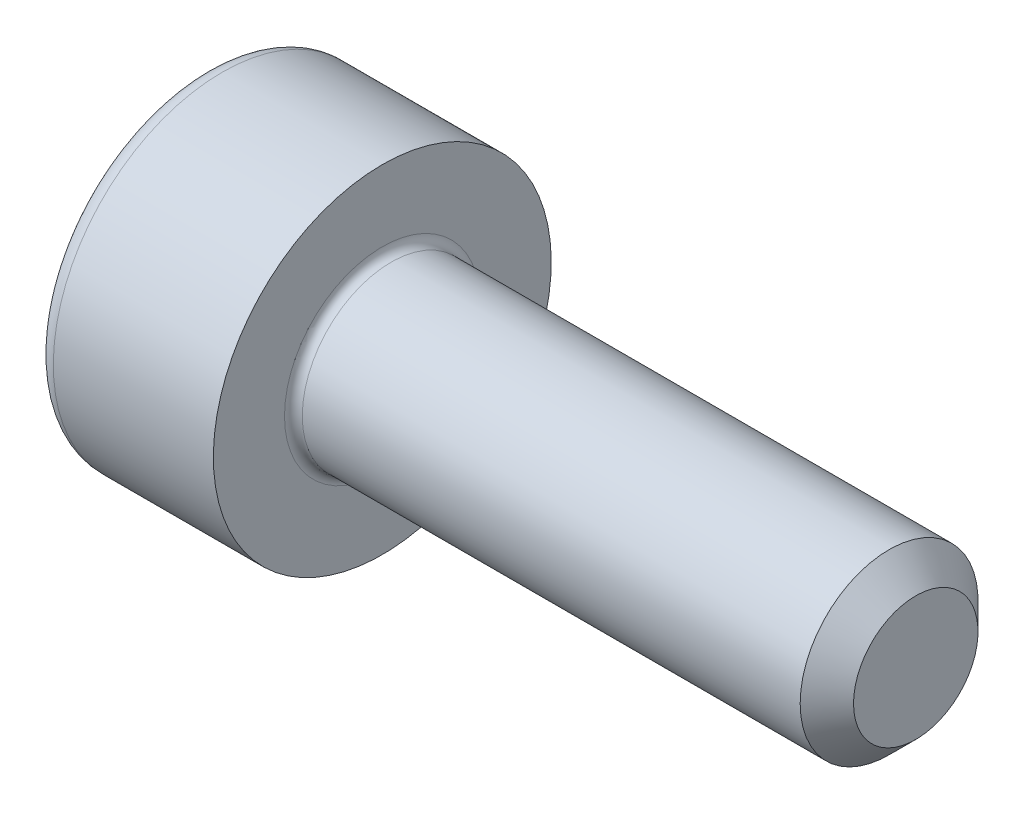
ISO-10303-21;
HEADER;
FILE_DESCRIPTION(('STEP AP214'),'2;1');
FILE_NAME('part.step','',(''),(''),'','','');
FILE_SCHEMA(('AUTOMOTIVE_DESIGN { 1 0 10303 214 1 1 1 1 }'));
ENDSEC;
DATA;
#1=APPLICATION_CONTEXT('core data for automotive mechanical design processes');
#2=APPLICATION_PROTOCOL_DEFINITION('international standard','automotive_design',2000,#1);
#3=PRODUCT_CONTEXT('',#1,'mechanical');
#4=PRODUCT('Part','Part','',(#3));
#5=PRODUCT_RELATED_PRODUCT_CATEGORY('part','',(#4));
#6=PRODUCT_DEFINITION_FORMATION('','',#4);
#7=PRODUCT_DEFINITION_CONTEXT('part definition',#1,'design');
#8=PRODUCT_DEFINITION('design','',#6,#7);
#9=PRODUCT_DEFINITION_SHAPE('','',#8);
#10=(LENGTH_UNIT() NAMED_UNIT(*) SI_UNIT(.MILLI.,.METRE.));
#11=(NAMED_UNIT(*) PLANE_ANGLE_UNIT() SI_UNIT($,.RADIAN.));
#12=(NAMED_UNIT(*) SI_UNIT($,.STERADIAN.) SOLID_ANGLE_UNIT());
#13=UNCERTAINTY_MEASURE_WITH_UNIT(LENGTH_MEASURE(1.E-05),#10,'distance_accuracy_value','');
#14=(GEOMETRIC_REPRESENTATION_CONTEXT(3) GLOBAL_UNCERTAINTY_ASSIGNED_CONTEXT((#13)) GLOBAL_UNIT_ASSIGNED_CONTEXT((#10,
#11,#12)) REPRESENTATION_CONTEXT('',''));
#15=CARTESIAN_POINT('',(0.,0.,0.));
#16=DIRECTION('',(0.,0.,1.));
#17=DIRECTION('',(1.,0.,0.));
#18=AXIS2_PLACEMENT_3D('',#15,#16,#17);
#19=CARTESIAN_POINT('',(-2.,0.,0.));
#20=DIRECTION('',(-1.,0.,0.));
#21=DIRECTION('',(0.,1.,0.));
#22=AXIS2_PLACEMENT_3D('',#19,#20,#21);
#23=PLANE('',#22);
#24=CARTESIAN_POINT('',(-2.,0.,0.));
#25=DIRECTION('',(1.,0.,0.));
#26=DIRECTION('',(0.,1.,0.));
#27=AXIS2_PLACEMENT_3D('',#24,#25,#26);
#28=CIRCLE('',#27,1.7);
#29=CARTESIAN_POINT('',(-2.,1.7,0.));
#30=VERTEX_POINT('',#29);
#31=EDGE_CURVE('E11',#30,#30,#28,.T.);
#32=ORIENTED_EDGE('',*,*,#31,.F.);
#33=EDGE_LOOP('',(#32));
#34=FACE_BOUND('',#33,.T.);
#35=DIRECTION('',(0.,0.500000000000005,-0.866025403784436));
#36=VECTOR('',#35,1.);
#37=CARTESIAN_POINT('',(-2.,0.433012701892217,0.750000000000003));
#38=LINE('',#37,#36);
#39=CARTESIAN_POINT('',(-2.,0.433012701892217,0.750000000000004));
#40=VERTEX_POINT('',#39);
#41=CARTESIAN_POINT('',(-2.,0.866025403784441,0.));
#42=VERTEX_POINT('',#41);
#43=EDGE_CURVE('E24',#40,#42,#38,.T.);
#44=ORIENTED_EDGE('',*,*,#43,.F.);
#45=DIRECTION('',(0.,1.,0.));
#46=VECTOR('',#45,1.);
#47=CARTESIAN_POINT('',(-2.,-0.433012701892221,0.750000000000003));
#48=LINE('',#47,#46);
#49=CARTESIAN_POINT('',(-2.,-0.433012701892221,0.750000000000003));
#50=VERTEX_POINT('',#49);
#51=EDGE_CURVE('E184',#50,#40,#48,.T.);
#52=ORIENTED_EDGE('',*,*,#51,.F.);
#53=DIRECTION('',(0.,0.499999999999999,0.866025403784439));
#54=VECTOR('',#53,1.);
#55=CARTESIAN_POINT('',(-2.,-0.86602540378444,0.));
#56=LINE('',#55,#54);
#57=CARTESIAN_POINT('',(-2.,-0.86602540378444,0.));
#58=VERTEX_POINT('',#57);
#59=EDGE_CURVE('E226',#58,#50,#56,.T.);
#60=ORIENTED_EDGE('',*,*,#59,.F.);
#61=DIRECTION('',(0.,-0.499999999999999,0.866025403784439));
#62=VECTOR('',#61,1.);
#63=CARTESIAN_POINT('',(-2.,-0.43301270189222,-0.750000000000001));
#64=LINE('',#63,#62);
#65=CARTESIAN_POINT('',(-2.,-0.433012701892221,-0.750000000000001));
#66=VERTEX_POINT('',#65);
#67=EDGE_CURVE('E133',#66,#58,#64,.T.);
#68=ORIENTED_EDGE('',*,*,#67,.F.);
#69=DIRECTION('',(0.,-1.,0.));
#70=VECTOR('',#69,1.);
#71=CARTESIAN_POINT('',(-2.,0.433012701892219,-0.749999999999998));
#72=LINE('',#71,#70);
#73=CARTESIAN_POINT('',(-2.,0.433012701892219,-0.749999999999998));
#74=VERTEX_POINT('',#73);
#75=EDGE_CURVE('E117',#74,#66,#72,.T.);
#76=ORIENTED_EDGE('',*,*,#75,.F.);
#77=DIRECTION('',(0.,-0.5,-0.866025403784439));
#78=VECTOR('',#77,1.);
#79=CARTESIAN_POINT('',(-2.,0.866025403784441,0.));
#80=LINE('',#79,#78);
#81=EDGE_CURVE('E111',#42,#74,#80,.T.);
#82=ORIENTED_EDGE('',*,*,#81,.F.);
#83=EDGE_LOOP('',(#44,#52,#60,#68,#76,#82));
#84=FACE_BOUND('',#83,.T.);
#85=ADVANCED_FACE('F17',(#34,#84),#23,.T.);
#86=CARTESIAN_POINT('',(-1.,0.,0.));
#87=DIRECTION('',(-1.,0.,0.));
#88=DIRECTION('',(0.,0.,1.));
#89=AXIS2_PLACEMENT_3D('',#86,#87,#88);
#90=CONICAL_SURFACE('',#89,0.866025403784438,1.0471975511966);
#91=CARTESIAN_POINT('',(-0.5,0.,0.));
#92=VERTEX_POINT('',#91);
#93=VERTEX_LOOP('',#92);
#94=FACE_BOUND('',#93,.T.);
#95=CARTESIAN_POINT('',(-0.933012701892204,0.,0.749999999999973));
#96=CARTESIAN_POINT('',(-0.933008833544879,0.0199213912756084,0.750000000000135));
#97=CARTESIAN_POINT('',(-0.933470994729893,0.0398405243523647,0.750000000000083));
#98=CARTESIAN_POINT('',(-0.935296784596608,0.0796264841816474,0.749999999999923));
#99=CARTESIAN_POINT('',(-0.936659909026974,0.0994933339552711,0.749999999999815));
#100=CARTESIAN_POINT('',(-0.94115593553694,0.149058236469928,0.749999999999938));
#101=CARTESIAN_POINT('',(-0.944832841581887,0.178707735224105,0.750000000000364));
#102=CARTESIAN_POINT('',(-0.953950481546132,0.237746808839611,0.749999999999642));
#103=CARTESIAN_POINT('',(-0.959392256286227,0.267136219783089,0.749999999998492));
#104=CARTESIAN_POINT('',(-0.970471226698135,0.319354671321508,0.749999999998111));
#105=CARTESIAN_POINT('',(-0.975819293302447,0.34224623989559,0.749999999998523));
#106=CARTESIAN_POINT('',(-0.987328994472387,0.387797508754008,0.750000000001483));
#107=CARTESIAN_POINT('',(-0.993489716114358,0.410457438925144,0.750000000004029));
#108=CARTESIAN_POINT('',(-1.,0.433012701878141,0.750000000008129));
#109=B_SPLINE_CURVE_WITH_KNOTS('',3,(#95,#96,#97,#98,#99,#100,#101,#102,#103,#104,#105,#106,
#107,#108),.UNSPECIFIED.,.F.,.F.,(4,2,2,2,2,2,4),(0.,0.059754808156758,0.119476201014601,
0.209043066262145,0.298662849379751,0.369171648737575,0.439601903682821),.UNSPECIFIED.);
#110=CARTESIAN_POINT('',(-0.933012701892221,0.,0.750000000000003));
#111=VERTEX_POINT('',#110);
#112=CARTESIAN_POINT('',(-0.999999999994507,0.433012701892217,0.750000000000004));
#113=VERTEX_POINT('',#112);
#114=EDGE_CURVE('E179',#111,#113,#109,.T.);
#115=ORIENTED_EDGE('',*,*,#114,.T.);
#116=CARTESIAN_POINT('',(-0.999999999997254,0.433012701887088,0.750000000002964));
#117=CARTESIAN_POINT('',(-0.993725594986995,0.44388203395943,0.731173764614613));
#118=CARTESIAN_POINT('',(-0.987775954947516,0.454799336624101,0.712264441718613));
#119=CARTESIAN_POINT('',(-0.976625475516025,0.476743748583125,0.674255605263011));
#120=CARTESIAN_POINT('',(-0.971425607529809,0.48777098088496,0.655155878648199));
#121=CARTESIAN_POINT('',(-0.959509689755132,0.515452172117026,0.607210649023551));
#122=CARTESIAN_POINT('',(-0.95333332833011,0.532165892430157,0.578261636265314));
#123=CARTESIAN_POINT('',(-0.943287736785978,0.565757815373363,0.520078718984595));
#124=CARTESIAN_POINT('',(-0.939417119088209,0.582635912853792,0.490844996586663));
#125=CARTESIAN_POINT('',(-0.933854884639651,0.619142178043651,0.427614290527316));
#126=CARTESIAN_POINT('',(-0.932598487714664,0.63878779243049,0.393587088350106));
#127=CARTESIAN_POINT('',(-0.933670888553846,0.678054088190912,0.325575868879079));
#128=CARTESIAN_POINT('',(-0.936000004780061,0.69767476719484,0.29159185568959));
#129=CARTESIAN_POINT('',(-0.94689156440335,0.750725165162678,0.19970586964693));
#130=CARTESIAN_POINT('',(-0.958722645304518,0.783985416881427,0.142097422205928));
#131=CARTESIAN_POINT('',(-0.981909295146268,0.833330188524845,0.0566297714484034));
#132=CARTESIAN_POINT('',(-0.990586361201697,0.849746087684786,0.0281966008665968));
#133=CARTESIAN_POINT('',(-0.999999999999389,0.86602540378444,-1.07214963685674E-11));
#134=B_SPLINE_CURVE_WITH_KNOTS('',3,(#116,#117,#118,#119,#120,#121,#122,#123,#124,#125,#126,
#127,#128,#129,#130,#131,#132,#133),.UNSPECIFIED.,.F.,.F.,(4,2,2,2,2,2,2,2,4),(0.,
0.0678778965122259,0.135842960401226,0.237750158057644,0.339595966637661,0.457362799036722,
0.575140091983207,0.77723010535451,0.879016706592094),.UNSPECIFIED.);
#135=CARTESIAN_POINT('',(-0.999999999998778,0.866025403784441,0.));
#136=VERTEX_POINT('',#135);
#137=EDGE_CURVE('E165',#113,#136,#134,.T.);
#138=ORIENTED_EDGE('',*,*,#137,.T.);
#139=CARTESIAN_POINT('',(-0.999999999999389,0.86602540378444,-1.9263149996095E-12));
#140=CARTESIAN_POINT('',(-0.993725594987899,0.855156071716782,-0.0188262353877419));
#141=CARTESIAN_POINT('',(-0.987775954948481,0.844238769054009,-0.0377355582799994));
#142=CARTESIAN_POINT('',(-0.976625475518107,0.82229435709808,-0.0757443947279822));
#143=CARTESIAN_POINT('',(-0.971425607532947,0.811267124797441,-0.0948441213389177));
#144=CARTESIAN_POINT('',(-0.959509689759815,0.783585933572798,-0.142789350957965));
#145=CARTESIAN_POINT('',(-0.953333328334982,0.766872213268472,-0.171738363715886));
#146=CARTESIAN_POINT('',(-0.943287736790654,0.733280290313264,-0.229921280978897));
#147=CARTESIAN_POINT('',(-0.939417119092502,0.716402192812047,-0.259155003359448));
#148=CARTESIAN_POINT('',(-0.933854884641243,0.679895927658915,-0.322385709443386));
#149=CARTESIAN_POINT('',(-0.93259848771494,0.660250313343309,-0.356412911670596));
#150=CARTESIAN_POINT('',(-0.933670888552937,0.620984017411546,-0.424424131060475));
#151=CARTESIAN_POINT('',(-0.936000004779282,0.601363338165015,-0.458408144118799));
#152=CARTESIAN_POINT('',(-0.94689156440336,0.548312938980402,-0.550294129467752));
#153=CARTESIAN_POINT('',(-0.958722645304526,0.5150526858833,-0.60790257611293));
#154=CARTESIAN_POINT('',(-0.981909295146271,0.465707914947231,-0.693370227278804));
#155=CARTESIAN_POINT('',(-0.990586361201698,0.449292016493224,-0.721803398268172));
#156=CARTESIAN_POINT('',(-0.999999999999388,0.433012701882926,-0.750000000005365));
#157=B_SPLINE_CURVE_WITH_KNOTS('',3,(#139,#140,#141,#142,#143,#144,#145,#146,#147,#148,#149,
#150,#151,#152,#153,#154,#155,#156),.UNSPECIFIED.,.F.,.F.,(4,2,2,2,2,2,2,2,4),(0.,
0.0678778965000533,0.135842960376759,0.237750158019345,0.339595966585644,0.457362799007784,
0.575140091977281,0.777230105348513,0.879016706586076),.UNSPECIFIED.);
#158=CARTESIAN_POINT('',(-0.999999999998775,0.433012701892219,-0.749999999999998));
#159=VERTEX_POINT('',#158);
#160=EDGE_CURVE('E151',#136,#159,#157,.T.);
#161=ORIENTED_EDGE('',*,*,#160,.T.);
#162=CARTESIAN_POINT('',(-0.999999999999388,0.433012701890549,-0.750000000000963));
#163=CARTESIAN_POINT('',(-0.9937255949879,0.411274037754983,-0.750000000001111));
#164=CARTESIAN_POINT('',(-0.987775954948483,0.389439432430544,-0.750000000000475));
#165=CARTESIAN_POINT('',(-0.976625475518111,0.345550608520348,-0.749999999999521));
#166=CARTESIAN_POINT('',(-0.971425607532951,0.323496143919626,-0.749999999999203));
#167=CARTESIAN_POINT('',(-0.959509689759821,0.268133761466942,-0.750000000001171));
#168=CARTESIAN_POINT('',(-0.953333328334989,0.234706320851946,-0.750000000004837));
#169=CARTESIAN_POINT('',(-0.943287736790661,0.1675224749583,-0.749999999995164));
#170=CARTESIAN_POINT('',(-0.939417119092509,0.133766279978958,-0.749999999981834));
#171=CARTESIAN_POINT('',(-0.933854884641246,0.0607537496344794,-0.750000000003901));
#172=CARTESIAN_POINT('',(-0.932598487714941,0.0214625209281991,-0.75000000004724));
#173=CARTESIAN_POINT('',(-0.933670888552935,-0.0570700707716807,-0.749999999952755));
#174=CARTESIAN_POINT('',(-0.936000004779278,-0.0963114290259993,-0.749999999814915));
#175=CARTESIAN_POINT('',(-0.946891564403355,-0.202412226182275,-0.749999999114611));
#176=CARTESIAN_POINT('',(-0.95872264530452,-0.268932730998118,-0.749999998318811));
#177=CARTESIAN_POINT('',(-0.981909295146268,-0.367622273577602,-0.749999998727188));
#178=CARTESIAN_POINT('',(-0.990586361201696,-0.400454071191554,-0.749999999134757));
#179=CARTESIAN_POINT('',(-0.999999999999388,-0.433012701901512,-0.749999999994636));
#180=B_SPLINE_CURVE_WITH_KNOTS('',3,(#162,#163,#164,#165,#166,#167,#168,#169,#170,#171,#172,
#173,#174,#175,#176,#177,#178,#179),.UNSPECIFIED.,.F.,.F.,(4,2,2,2,2,2,2,2,4),(0.,
0.0678778965000383,0.135842960376729,0.237750158019295,0.339595966585576,0.457362799007724,
0.575140091977229,0.777230105348485,0.879016706586073),.UNSPECIFIED.);
#181=CARTESIAN_POINT('',(-0.999999999998777,-0.433012701892221,-0.750000000000001));
#182=VERTEX_POINT('',#181);
#183=EDGE_CURVE('E126',#159,#182,#180,.T.);
#184=ORIENTED_EDGE('',*,*,#183,.T.);
#185=CARTESIAN_POINT('',(-0.999999999999388,-0.433012701893893,-0.749999999999034));
#186=CARTESIAN_POINT('',(-0.993725594987898,-0.443882033961809,-0.731173764613362));
#187=CARTESIAN_POINT('',(-0.987775954948478,-0.454799336623482,-0.712264441720464));
#188=CARTESIAN_POINT('',(-0.976625475518102,-0.476743748577763,-0.674255605271519));
#189=CARTESIAN_POINT('',(-0.971425607532941,-0.487770980877854,-0.655155878660261));
#190=CARTESIAN_POINT('',(-0.959509689759808,-0.515452172105912,-0.607210649043171));
#191=CARTESIAN_POINT('',(-0.953333328334974,-0.532165892416592,-0.578261636288909));
#192=CARTESIAN_POINT('',(-0.943287736790646,-0.565757815355052,-0.52007871901621));
#193=CARTESIAN_POINT('',(-0.939417119092496,-0.582635912833186,-0.490844996622323));
#194=CARTESIAN_POINT('',(-0.933854884641239,-0.619142178024548,-0.427614290560433));
#195=CARTESIAN_POINT('',(-0.932598487714939,-0.638787792415225,-0.393587088376551));
#196=CARTESIAN_POINT('',(-0.933670888552943,-0.678054088183349,-0.325575868892165));
#197=CARTESIAN_POINT('',(-0.936000004779293,-0.69767476719114,-0.291591855695991));
#198=CARTESIAN_POINT('',(-0.946891564403382,-0.750725165162782,-0.199705869646749));
#199=CARTESIAN_POINT('',(-0.958722645304547,-0.783985416881501,-0.142097422205796));
#200=CARTESIAN_POINT('',(-0.981909295146284,-0.833330188524874,-0.0566297714483446));
#201=CARTESIAN_POINT('',(-0.990586361201705,-0.849746087684799,-0.0281966008665637));
#202=CARTESIAN_POINT('',(-0.999999999999388,-0.866025403784439,1.07311981421065E-11));
#203=B_SPLINE_CURVE_WITH_KNOTS('',3,(#185,#186,#187,#188,#189,#190,#191,#192,#193,#194,#195,
#196,#197,#198,#199,#200,#201,#202),.UNSPECIFIED.,.F.,.F.,(4,2,2,2,2,2,2,2,4),(0.,
0.0678778965000681,0.135842960376788,0.237750158019398,0.339595966585721,0.457362799007898,
0.575140091977433,0.777230105348577,0.879016706586072),.UNSPECIFIED.);
#204=CARTESIAN_POINT('',(-0.999999999998777,-0.86602540378444,0.));
#205=VERTEX_POINT('',#204);
#206=EDGE_CURVE('E158',#182,#205,#203,.T.);
#207=ORIENTED_EDGE('',*,*,#206,.T.);
#208=CARTESIAN_POINT('',(-0.999999999999388,-0.866025403784439,1.93411096122033E-12));
#209=CARTESIAN_POINT('',(-0.9937255949879,-0.855156071716783,0.0188262353877477));
#210=CARTESIAN_POINT('',(-0.987775954948482,-0.844238769054011,0.0377355582800032));
#211=CARTESIAN_POINT('',(-0.976625475518109,-0.822294357098084,0.0757443947279829));
#212=CARTESIAN_POINT('',(-0.971425607532949,-0.811267124797445,0.0948441213389174));
#213=CARTESIAN_POINT('',(-0.959509689759818,-0.783585933572804,0.142789350957962));
#214=CARTESIAN_POINT('',(-0.953333328334986,-0.766872213268478,0.171738363715882));
#215=CARTESIAN_POINT('',(-0.943287736790656,-0.733280290313272,0.22992128097889));
#216=CARTESIAN_POINT('',(-0.939417119092502,-0.716402192812056,0.259155003359439));
#217=CARTESIAN_POINT('',(-0.93385488464125,-0.679895927658923,0.322385709443379));
#218=CARTESIAN_POINT('',(-0.932598487714961,-0.660250313343315,0.356412911670594));
#219=CARTESIAN_POINT('',(-0.93367088855292,-0.620984017411546,0.424424131060482));
#220=CARTESIAN_POINT('',(-0.93600000477921,-0.601363338165012,0.458408144118811));
#221=CARTESIAN_POINT('',(-0.946891564403489,-0.548312938980411,0.550294129467742));
#222=CARTESIAN_POINT('',(-0.95872264530516,-0.515052685883359,0.607902576112836));
#223=CARTESIAN_POINT('',(-0.981909295145933,-0.465707914947253,0.693370227278773));
#224=CARTESIAN_POINT('',(-0.990586361200703,-0.449292016493269,0.721803398268102));
#225=CARTESIAN_POINT('',(-0.999999999997254,-0.43301270188293,0.750000000005365));
#226=B_SPLINE_CURVE_WITH_KNOTS('',3,(#208,#209,#210,#211,#212,#213,#214,#215,#216,#217,#218,
#219,#220,#221,#222,#223,#224,#225),.UNSPECIFIED.,.F.,.F.,(4,2,2,2,2,2,2,2,4),(0.,
0.0678778965000461,0.135842960376748,0.237750158019329,0.33959596658562,0.457362799007785,
0.575140091977258,0.777230105348594,0.879016706585525),.UNSPECIFIED.);
#227=CARTESIAN_POINT('',(-0.999999999994508,-0.433012701892221,0.750000000000003));
#228=VERTEX_POINT('',#227);
#229=EDGE_CURVE('E172',#205,#228,#226,.T.);
#230=ORIENTED_EDGE('',*,*,#229,.T.);
#231=CARTESIAN_POINT('',(-0.999999999997254,-0.433012701878144,0.750000000008128));
#232=CARTESIAN_POINT('',(-0.990556996500291,-0.400285242719805,0.750000000002961));
#233=CARTESIAN_POINT('',(-0.981842849756315,-0.367328249887462,0.750000000000806));
#234=CARTESIAN_POINT('',(-0.96628677907055,-0.301139660804241,0.749999999999203));
#235=CARTESIAN_POINT('',(-0.959436379461823,-0.267910040547365,0.749999999999742));
#236=CARTESIAN_POINT('',(-0.947036724027862,-0.195879816811318,0.750000000000258));
#237=CARTESIAN_POINT('',(-0.941853350505028,-0.157013533752798,0.750000000000135));
#238=CARTESIAN_POINT('',(-0.934806333523548,-0.0787766988136589,0.74999999999987));
#239=CARTESIAN_POINT('',(-0.932960632852675,-0.039404560661845,0.749999999999728));
#240=CARTESIAN_POINT('',(-0.933012701892204,0.,0.749999999999973));
#241=B_SPLINE_CURVE_WITH_KNOTS('',3,(#231,#232,#233,#234,#235,#236,#237,#238,#239,#240),
.UNSPECIFIED.,.F.,.F.,(4,2,2,2,4),(0.,0.102205558125607,0.203938242263253,0.321428325826841,
0.439548160359031),.UNSPECIFIED.);
#242=EDGE_CURVE('E183',#228,#111,#241,.T.);
#243=ORIENTED_EDGE('',*,*,#242,.T.);
#244=EDGE_LOOP('',(#115,#138,#161,#184,#207,#230,#243));
#245=FACE_BOUND('',#244,.T.);
#246=ADVANCED_FACE('F139',(#94,#245),#90,.F.);
#247=CARTESIAN_POINT('',(0.5,-0.433012701892221,0.750000000000003));
#248=DIRECTION('',(0.,0.,1.));
#249=DIRECTION('',(0.,1.,0.));
#250=AXIS2_PLACEMENT_3D('',#247,#248,#249);
#251=PLANE('',#250);
#252=ORIENTED_EDGE('',*,*,#242,.F.);
#253=DIRECTION('',(-1.,0.,0.));
#254=VECTOR('',#253,1.);
#255=CARTESIAN_POINT('',(-0.999999999994508,-0.433012701892221,0.750000000000003));
#256=LINE('',#255,#254);
#257=EDGE_CURVE('E222',#228,#50,#256,.T.);
#258=ORIENTED_EDGE('',*,*,#257,.T.);
#259=ORIENTED_EDGE('',*,*,#51,.T.);
#260=DIRECTION('',(-1.,0.,0.));
#261=VECTOR('',#260,1.);
#262=CARTESIAN_POINT('',(-0.999999999994507,0.433012701892217,0.750000000000004));
#263=LINE('',#262,#261);
#264=EDGE_CURVE('E120',#113,#40,#263,.T.);
#265=ORIENTED_EDGE('',*,*,#264,.F.);
#266=ORIENTED_EDGE('',*,*,#114,.F.);
#267=EDGE_LOOP('',(#252,#258,#259,#265,#266));
#268=FACE_BOUND('',#267,.T.);
#269=ADVANCED_FACE('F143',(#268),#251,.F.);
#270=CARTESIAN_POINT('',(0.5,-0.86602540378444,0.));
#271=DIRECTION('',(0.,-0.866025403784439,0.5));
#272=DIRECTION('',(0.,0.5,0.866025403784439));
#273=AXIS2_PLACEMENT_3D('',#270,#271,#272);
#274=PLANE('',#273);
#275=ORIENTED_EDGE('',*,*,#229,.F.);
#276=DIRECTION('',(-1.,0.,0.));
#277=VECTOR('',#276,1.);
#278=CARTESIAN_POINT('',(-0.999999999998777,-0.86602540378444,0.));
#279=LINE('',#278,#277);
#280=EDGE_CURVE('E229',#205,#58,#279,.T.);
#281=ORIENTED_EDGE('',*,*,#280,.T.);
#282=ORIENTED_EDGE('',*,*,#59,.T.);
#283=ORIENTED_EDGE('',*,*,#257,.F.);
#284=EDGE_LOOP('',(#275,#281,#282,#283));
#285=FACE_BOUND('',#284,.T.);
#286=ADVANCED_FACE('F190',(#285),#274,.F.);
#287=CARTESIAN_POINT('',(0.5,-0.433012701892221,-0.750000000000001));
#288=DIRECTION('',(0.,-0.866025403784439,-0.499999999999999));
#289=DIRECTION('',(0.,-0.499999999999999,0.866025403784439));
#290=AXIS2_PLACEMENT_3D('',#287,#288,#289);
#291=PLANE('',#290);
#292=ORIENTED_EDGE('',*,*,#206,.F.);
#293=DIRECTION('',(-1.,0.,0.));
#294=VECTOR('',#293,1.);
#295=CARTESIAN_POINT('',(-0.999999999998777,-0.433012701892221,-0.750000000000001));
#296=LINE('',#295,#294);
#297=EDGE_CURVE('E123',#182,#66,#296,.T.);
#298=ORIENTED_EDGE('',*,*,#297,.T.);
#299=ORIENTED_EDGE('',*,*,#67,.T.);
#300=ORIENTED_EDGE('',*,*,#280,.F.);
#301=EDGE_LOOP('',(#292,#298,#299,#300));
#302=FACE_BOUND('',#301,.T.);
#303=ADVANCED_FACE('F201',(#302),#291,.F.);
#304=CARTESIAN_POINT('',(0.5,0.433012701892219,-0.749999999999998));
#305=DIRECTION('',(0.,0.,-1.));
#306=DIRECTION('',(0.,-1.,0.));
#307=AXIS2_PLACEMENT_3D('',#304,#305,#306);
#308=PLANE('',#307);
#309=ORIENTED_EDGE('',*,*,#183,.F.);
#310=DIRECTION('',(-1.,0.,0.));
#311=VECTOR('',#310,1.);
#312=CARTESIAN_POINT('',(-0.999999999998775,0.433012701892219,-0.749999999999998));
#313=LINE('',#312,#311);
#314=EDGE_CURVE('E114',#159,#74,#313,.T.);
#315=ORIENTED_EDGE('',*,*,#314,.T.);
#316=ORIENTED_EDGE('',*,*,#75,.T.);
#317=ORIENTED_EDGE('',*,*,#297,.F.);
#318=EDGE_LOOP('',(#309,#315,#316,#317));
#319=FACE_BOUND('',#318,.T.);
#320=ADVANCED_FACE('F135',(#319),#308,.F.);
#321=CARTESIAN_POINT('',(0.5,0.866025403784441,0.));
#322=DIRECTION('',(0.,0.866025403784439,-0.5));
#323=DIRECTION('',(0.,-0.5,-0.866025403784439));
#324=AXIS2_PLACEMENT_3D('',#321,#322,#323);
#325=PLANE('',#324);
#326=ORIENTED_EDGE('',*,*,#160,.F.);
#327=DIRECTION('',(-1.,0.,0.));
#328=VECTOR('',#327,1.);
#329=CARTESIAN_POINT('',(-0.999999999998778,0.866025403784441,0.));
#330=LINE('',#329,#328);
#331=EDGE_CURVE('E108',#136,#42,#330,.T.);
#332=ORIENTED_EDGE('',*,*,#331,.T.);
#333=ORIENTED_EDGE('',*,*,#81,.T.);
#334=ORIENTED_EDGE('',*,*,#314,.F.);
#335=EDGE_LOOP('',(#326,#332,#333,#334));
#336=FACE_BOUND('',#335,.T.);
#337=ADVANCED_FACE('F197',(#336),#325,.F.);
#338=CARTESIAN_POINT('',(0.5,0.433012701892217,0.750000000000004));
#339=DIRECTION('',(0.,0.866025403784436,0.500000000000005));
#340=DIRECTION('',(0.,0.500000000000005,-0.866025403784436));
#341=AXIS2_PLACEMENT_3D('',#338,#339,#340);
#342=PLANE('',#341);
#343=ORIENTED_EDGE('',*,*,#137,.F.);
#344=ORIENTED_EDGE('',*,*,#264,.T.);
#345=ORIENTED_EDGE('',*,*,#43,.T.);
#346=ORIENTED_EDGE('',*,*,#331,.F.);
#347=EDGE_LOOP('',(#343,#344,#345,#346));
#348=FACE_BOUND('',#347,.T.);
#349=ADVANCED_FACE('F192',(#348),#342,.F.);
#350=CARTESIAN_POINT('',(-2.,0.,0.));
#351=DIRECTION('',(1.,0.,0.));
#352=DIRECTION('',(0.,1.,0.));
#353=AXIS2_PLACEMENT_3D('',#350,#351,#352);
#354=CYLINDRICAL_SURFACE('',#353,1.9);
#355=CARTESIAN_POINT('',(0.,0.,0.));
#356=DIRECTION('',(1.,0.,0.));
#357=DIRECTION('',(0.,1.,0.));
#358=AXIS2_PLACEMENT_3D('',#355,#356,#357);
#359=CIRCLE('',#358,1.9);
#360=CARTESIAN_POINT('',(0.,1.9,0.));
#361=VERTEX_POINT('',#360);
#362=EDGE_CURVE('E105',#361,#361,#359,.T.);
#363=ORIENTED_EDGE('',*,*,#362,.F.);
#364=EDGE_LOOP('',(#363));
#365=FACE_BOUND('',#364,.T.);
#366=CARTESIAN_POINT('',(-1.8,0.,0.));
#367=DIRECTION('',(1.,0.,0.));
#368=DIRECTION('',(0.,1.,0.));
#369=AXIS2_PLACEMENT_3D('',#366,#367,#368);
#370=CIRCLE('',#369,1.9);
#371=CARTESIAN_POINT('',(-1.8,1.9,0.));
#372=VERTEX_POINT('',#371);
#373=EDGE_CURVE('E103',#372,#372,#370,.T.);
#374=ORIENTED_EDGE('',*,*,#373,.T.);
#375=EDGE_LOOP('',(#374));
#376=FACE_BOUND('',#375,.T.);
#377=ADVANCED_FACE('F196',(#365,#376),#354,.T.);
#378=CARTESIAN_POINT('',(0.,0.,0.));
#379=DIRECTION('',(1.,0.,0.));
#380=DIRECTION('',(0.,1.,0.));
#381=AXIS2_PLACEMENT_3D('',#378,#379,#380);
#382=PLANE('',#381);
#383=ORIENTED_EDGE('',*,*,#362,.T.);
#384=EDGE_LOOP('',(#383));
#385=FACE_BOUND('',#384,.T.);
#386=CARTESIAN_POINT('',(0.,0.,0.));
#387=DIRECTION('',(1.,0.,0.));
#388=DIRECTION('',(0.,0.,1.));
#389=AXIS2_PLACEMENT_3D('',#386,#387,#388);
#390=CIRCLE('',#389,1.1);
#391=CARTESIAN_POINT('',(0.,0.,1.1));
#392=VERTEX_POINT('',#391);
#393=EDGE_CURVE('E95',#392,#392,#390,.T.);
#394=ORIENTED_EDGE('',*,*,#393,.F.);
#395=EDGE_LOOP('',(#394));
#396=FACE_BOUND('',#395,.T.);
#397=ADVANCED_FACE('F244',(#385,#396),#382,.T.);
#398=CARTESIAN_POINT('',(0.,0.,0.));
#399=DIRECTION('',(1.,0.,0.));
#400=DIRECTION('',(0.,0.,1.));
#401=AXIS2_PLACEMENT_3D('',#398,#399,#400);
#402=CYLINDRICAL_SURFACE('',#401,1.);
#403=CARTESIAN_POINT('',(5.7,0.,0.));
#404=DIRECTION('',(1.,0.,0.));
#405=DIRECTION('',(0.,0.,1.));
#406=AXIS2_PLACEMENT_3D('',#403,#404,#405);
#407=CIRCLE('',#406,1.);
#408=CARTESIAN_POINT('',(5.7,0.,1.));
#409=VERTEX_POINT('',#408);
#410=EDGE_CURVE('E100',#409,#409,#407,.T.);
#411=ORIENTED_EDGE('',*,*,#410,.F.);
#412=EDGE_LOOP('',(#411));
#413=FACE_BOUND('',#412,.T.);
#414=CARTESIAN_POINT('',(0.1,0.,0.));
#415=DIRECTION('',(1.,0.,0.));
#416=DIRECTION('',(0.,0.,1.));
#417=AXIS2_PLACEMENT_3D('',#414,#415,#416);
#418=CIRCLE('',#417,1.);
#419=CARTESIAN_POINT('',(0.1,0.,1.));
#420=VERTEX_POINT('',#419);
#421=EDGE_CURVE('E89',#420,#420,#418,.T.);
#422=ORIENTED_EDGE('',*,*,#421,.T.);
#423=EDGE_LOOP('',(#422));
#424=FACE_BOUND('',#423,.T.);
#425=ADVANCED_FACE('F90',(#413,#424),#402,.T.);
#426=CARTESIAN_POINT('',(5.7,0.,0.));
#427=DIRECTION('',(-1.,0.,0.));
#428=DIRECTION('',(0.,0.,1.));
#429=AXIS2_PLACEMENT_3D('',#426,#427,#428);
#430=CONICAL_SURFACE('',#429,1.,0.785398163397449);
#431=CARTESIAN_POINT('',(6.,0.,0.));
#432=DIRECTION('',(1.,0.,0.));
#433=DIRECTION('',(0.,0.,1.));
#434=AXIS2_PLACEMENT_3D('',#431,#432,#433);
#435=CIRCLE('',#434,0.7);
#436=CARTESIAN_POINT('',(6.,0.,0.7));
#437=VERTEX_POINT('',#436);
#438=EDGE_CURVE('E92',#437,#437,#435,.T.);
#439=ORIENTED_EDGE('',*,*,#438,.F.);
#440=EDGE_LOOP('',(#439));
#441=FACE_BOUND('',#440,.T.);
#442=ORIENTED_EDGE('',*,*,#410,.T.);
#443=EDGE_LOOP('',(#442));
#444=FACE_BOUND('',#443,.T.);
#445=ADVANCED_FACE('F251',(#441,#444),#430,.T.);
#446=CARTESIAN_POINT('',(6.,0.,0.));
#447=DIRECTION('',(1.,0.,0.));
#448=DIRECTION('',(0.,0.,1.));
#449=AXIS2_PLACEMENT_3D('',#446,#447,#448);
#450=PLANE('',#449);
#451=ORIENTED_EDGE('',*,*,#438,.T.);
#452=EDGE_LOOP('',(#451));
#453=FACE_BOUND('',#452,.T.);
#454=ADVANCED_FACE('F255',(#453),#450,.T.);
#455=CARTESIAN_POINT('',(-1.8,0.,0.));
#456=DIRECTION('',(1.,0.,0.));
#457=DIRECTION('',(0.,1.,0.));
#458=AXIS2_PLACEMENT_3D('',#455,#456,#457);
#459=TOROIDAL_SURFACE('',#458,1.7,0.2);
#460=ORIENTED_EDGE('',*,*,#373,.F.);
#461=EDGE_LOOP('',(#460));
#462=FACE_BOUND('',#461,.T.);
#463=ORIENTED_EDGE('',*,*,#31,.T.);
#464=EDGE_LOOP('',(#463));
#465=FACE_BOUND('',#464,.T.);
#466=ADVANCED_FACE('F144',(#462,#465),#459,.T.);
#467=CARTESIAN_POINT('',(0.1,0.,0.));
#468=DIRECTION('',(1.,0.,0.));
#469=DIRECTION('',(0.,0.,1.));
#470=AXIS2_PLACEMENT_3D('',#467,#468,#469);
#471=TOROIDAL_SURFACE('',#470,1.1,0.1);
#472=ORIENTED_EDGE('',*,*,#421,.F.);
#473=EDGE_LOOP('',(#472));
#474=FACE_BOUND('',#473,.T.);
#475=ORIENTED_EDGE('',*,*,#393,.T.);
#476=EDGE_LOOP('',(#475));
#477=FACE_BOUND('',#476,.T.);
#478=ADVANCED_FACE('F257',(#474,#477),#471,.F.);
#479=CLOSED_SHELL('',(#85,#246,#269,#286,#303,#320,#337,#349,#377,#397,#425,#445,#454,#466,#478));
#480=MANIFOLD_SOLID_BREP('B1',#479);
#481=ADVANCED_BREP_SHAPE_REPRESENTATION('',(#18,#480),#14);
#482=SHAPE_DEFINITION_REPRESENTATION(#9,#481);
ENDSEC;
END-ISO-10303-21;
